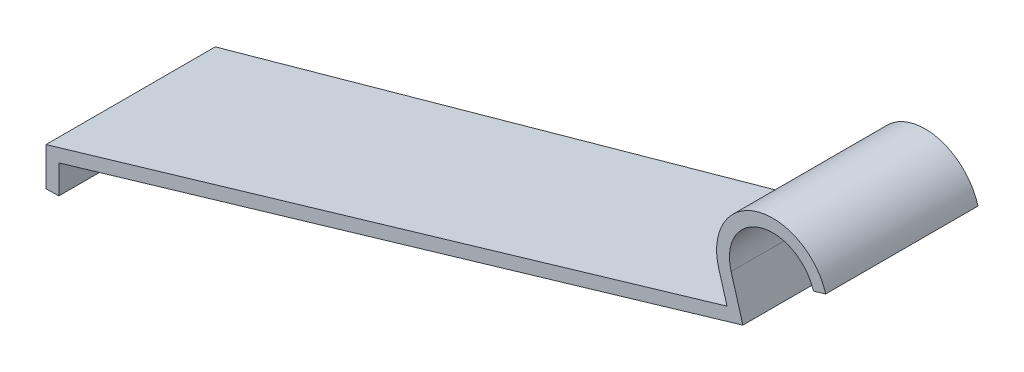
ISO-10303-21;
HEADER;
FILE_DESCRIPTION(('STEP AP214'),'2;1');
FILE_NAME('part.step','',(''),(''),'','','');
FILE_SCHEMA(('AUTOMOTIVE_DESIGN { 1 0 10303 214 1 1 1 1 }'));
ENDSEC;
DATA;
#1=APPLICATION_CONTEXT('core data for automotive mechanical design processes');
#2=APPLICATION_PROTOCOL_DEFINITION('international standard','automotive_design',2000,#1);
#3=PRODUCT_CONTEXT('',#1,'mechanical');
#4=PRODUCT('Part','Part','',(#3));
#5=PRODUCT_RELATED_PRODUCT_CATEGORY('part','',(#4));
#6=PRODUCT_DEFINITION_FORMATION('','',#4);
#7=PRODUCT_DEFINITION_CONTEXT('part definition',#1,'design');
#8=PRODUCT_DEFINITION('design','',#6,#7);
#9=PRODUCT_DEFINITION_SHAPE('','',#8);
#10=(LENGTH_UNIT() NAMED_UNIT(*) SI_UNIT(.MILLI.,.METRE.));
#11=(NAMED_UNIT(*) PLANE_ANGLE_UNIT() SI_UNIT($,.RADIAN.));
#12=(NAMED_UNIT(*) SI_UNIT($,.STERADIAN.) SOLID_ANGLE_UNIT());
#13=UNCERTAINTY_MEASURE_WITH_UNIT(LENGTH_MEASURE(1.E-05),#10,'distance_accuracy_value','');
#14=(GEOMETRIC_REPRESENTATION_CONTEXT(3) GLOBAL_UNCERTAINTY_ASSIGNED_CONTEXT((#13)) GLOBAL_UNIT_ASSIGNED_CONTEXT((#10,
#11,#12)) REPRESENTATION_CONTEXT('',''));
#15=CARTESIAN_POINT('',(0.,0.,0.));
#16=DIRECTION('',(0.,0.,1.));
#17=DIRECTION('',(1.,0.,0.));
#18=AXIS2_PLACEMENT_3D('',#15,#16,#17);
#19=CARTESIAN_POINT('',(-0.3,0.903691041971821,2.));
#20=DIRECTION('',(0.275637355816999,-0.961261695938319,0.));
#21=DIRECTION('',(0.961261695938319,0.275637355816999,0.));
#22=AXIS2_PLACEMENT_3D('',#19,#20,#21);
#23=PLANE('',#22);
#24=DIRECTION('',(0.,0.,-1.));
#25=VECTOR('',#24,1.);
#26=CARTESIAN_POINT('',(-0.3,0.903691041971821,2.));
#27=LINE('',#26,#25);
#28=CARTESIAN_POINT('',(-0.3,0.903691041971821,2.));
#29=VERTEX_POINT('',#28);
#30=CARTESIAN_POINT('',(-0.3,0.903691041971823,-2.));
#31=VERTEX_POINT('',#30);
#32=EDGE_CURVE('E10',#29,#31,#27,.T.);
#33=ORIENTED_EDGE('',*,*,#32,.F.);
#34=DIRECTION('',(0.96120822699316,0.275622023843694,-0.0105472429085632));
#35=VECTOR('',#34,1.);
#36=CARTESIAN_POINT('',(-0.3,0.903691041971821,2.));
#37=LINE('',#36,#35);
#38=CARTESIAN_POINT('',(15.6203859417955,5.46878825028108,1.82530717797592));
#39=VERTEX_POINT('',#38);
#40=EDGE_CURVE('E30',#29,#39,#37,.T.);
#41=ORIENTED_EDGE('',*,*,#40,.T.);
#42=DIRECTION('',(0.,0.,-1.));
#43=VECTOR('',#42,1.);
#44=CARTESIAN_POINT('',(15.6203859417955,5.46878825028108,2.));
#45=LINE('',#44,#43);
#46=CARTESIAN_POINT('',(15.6203859417955,5.46878825028108,-1.82530717797592));
#47=VERTEX_POINT('',#46);
#48=EDGE_CURVE('E98',#39,#47,#45,.T.);
#49=ORIENTED_EDGE('',*,*,#48,.T.);
#50=DIRECTION('',(-0.96120822699316,-0.275622023843694,-0.0105472429085632));
#51=VECTOR('',#50,1.);
#52=CARTESIAN_POINT('',(-0.259447613376775,0.915319251717538,-1.99955502266811));
#53=LINE('',#52,#51);
#54=EDGE_CURVE('E125',#47,#31,#53,.T.);
#55=ORIENTED_EDGE('',*,*,#54,.T.);
#56=EDGE_LOOP('',(#33,#41,#49,#55));
#57=FACE_BOUND('',#56,.T.);
#58=ADVANCED_FACE('F16',(#57),#23,.F.);
#59=CARTESIAN_POINT('',(-0.3,0.903691041971821,2.));
#60=DIRECTION('',(1.,0.,0.));
#61=DIRECTION('',(0.,1.,0.));
#62=AXIS2_PLACEMENT_3D('',#59,#60,#61);
#63=PLANE('',#62);
#64=DIRECTION('',(0.,-1.,0.));
#65=VECTOR('',#64,1.);
#66=CARTESIAN_POINT('',(-0.3,0.903691041971821,-2.));
#67=LINE('',#66,#65);
#68=CARTESIAN_POINT('',(-0.3,0.,-2.));
#69=VERTEX_POINT('',#68);
#70=EDGE_CURVE('E99',#31,#69,#67,.T.);
#71=ORIENTED_EDGE('',*,*,#70,.T.);
#72=DIRECTION('',(0.,0.,-1.));
#73=VECTOR('',#72,1.);
#74=CARTESIAN_POINT('',(-0.3,0.,2.));
#75=LINE('',#74,#73);
#76=CARTESIAN_POINT('',(-0.3,0.,2.));
#77=VERTEX_POINT('',#76);
#78=EDGE_CURVE('E23',#77,#69,#75,.T.);
#79=ORIENTED_EDGE('',*,*,#78,.F.);
#80=DIRECTION('',(0.,-1.,0.));
#81=VECTOR('',#80,1.);
#82=CARTESIAN_POINT('',(-0.3,0.903691041971821,2.));
#83=LINE('',#82,#81);
#84=EDGE_CURVE('E90',#29,#77,#83,.T.);
#85=ORIENTED_EDGE('',*,*,#84,.F.);
#86=ORIENTED_EDGE('',*,*,#32,.T.);
#87=EDGE_LOOP('',(#71,#79,#85,#86));
#88=FACE_BOUND('',#87,.T.);
#89=ADVANCED_FACE('F108',(#88),#63,.F.);
#90=CARTESIAN_POINT('',(-0.3,0.,2.));
#91=DIRECTION('',(0.,1.,0.));
#92=DIRECTION('',(0.,0.,1.));
#93=AXIS2_PLACEMENT_3D('',#90,#91,#92);
#94=PLANE('',#93);
#95=DIRECTION('',(0.,0.,-1.));
#96=VECTOR('',#95,1.);
#97=CARTESIAN_POINT('',(0.,0.,2.));
#98=LINE('',#97,#96);
#99=CARTESIAN_POINT('',(0.,0.,1.99670812963965));
#100=VERTEX_POINT('',#99);
#101=CARTESIAN_POINT('',(0.,0.,-1.99670812963965));
#102=VERTEX_POINT('',#101);
#103=EDGE_CURVE('E105',#100,#102,#98,.T.);
#104=ORIENTED_EDGE('',*,*,#103,.F.);
#105=DIRECTION('',(0.999939803155541,0.,-0.0109722406671593));
#106=VECTOR('',#105,1.);
#107=CARTESIAN_POINT('',(17.9267202021632,0.,1.8));
#108=LINE('',#107,#106);
#109=EDGE_CURVE('E93',#77,#100,#108,.T.);
#110=ORIENTED_EDGE('',*,*,#109,.F.);
#111=ORIENTED_EDGE('',*,*,#78,.T.);
#112=DIRECTION('',(-0.999939803155541,0.,-0.0109722406671592));
#113=VECTOR('',#112,1.);
#114=CARTESIAN_POINT('',(17.9267202021632,0.,-1.8));
#115=LINE('',#114,#113);
#116=EDGE_CURVE('E38',#102,#69,#115,.T.);
#117=ORIENTED_EDGE('',*,*,#116,.F.);
#118=EDGE_LOOP('',(#104,#110,#111,#117));
#119=FACE_BOUND('',#118,.T.);
#120=ADVANCED_FACE('F104',(#119),#94,.F.);
#121=CARTESIAN_POINT('',(0.,0.677624826940983,2.));
#122=DIRECTION('',(-1.,0.,0.));
#123=DIRECTION('',(0.,-1.,0.));
#124=AXIS2_PLACEMENT_3D('',#121,#122,#123);
#125=PLANE('',#124);
#126=DIRECTION('',(0.,0.,-1.));
#127=VECTOR('',#126,1.);
#128=CARTESIAN_POINT('',(0.,0.677624826940983,2.));
#129=LINE('',#128,#127);
#130=CARTESIAN_POINT('',(0.,0.677624826940983,1.99670812963965));
#131=VERTEX_POINT('',#130);
#132=CARTESIAN_POINT('',(0.,0.677624826940983,-1.99670812963965));
#133=VERTEX_POINT('',#132);
#134=EDGE_CURVE('E109',#131,#133,#129,.T.);
#135=ORIENTED_EDGE('',*,*,#134,.F.);
#136=DIRECTION('',(0.,-1.,0.));
#137=VECTOR('',#136,1.);
#138=CARTESIAN_POINT('',(0.,0.677624826940983,1.99670812963965));
#139=LINE('',#138,#137);
#140=EDGE_CURVE('E150',#131,#100,#139,.T.);
#141=ORIENTED_EDGE('',*,*,#140,.T.);
#142=ORIENTED_EDGE('',*,*,#103,.T.);
#143=DIRECTION('',(0.,1.,0.));
#144=VECTOR('',#143,1.);
#145=CARTESIAN_POINT('',(0.,0.677624826940983,-1.99670812963965));
#146=LINE('',#145,#144);
#147=EDGE_CURVE('E128',#102,#133,#146,.T.);
#148=ORIENTED_EDGE('',*,*,#147,.T.);
#149=EDGE_LOOP('',(#135,#141,#142,#148));
#150=FACE_BOUND('',#149,.T.);
#151=ADVANCED_FACE('F190',(#150),#125,.F.);
#152=CARTESIAN_POINT('',(0.,0.677624826940983,2.));
#153=DIRECTION('',(-0.275637355816999,0.961261695938319,0.));
#154=DIRECTION('',(-0.961261695938319,-0.275637355816999,0.));
#155=AXIS2_PLACEMENT_3D('',#152,#153,#154);
#156=PLANE('',#155);
#157=DIRECTION('',(0.,0.,-1.));
#158=VECTOR('',#157,1.);
#159=CARTESIAN_POINT('',(15.9914556573221,5.26310094824469,2.));
#160=LINE('',#159,#158);
#161=CARTESIAN_POINT('',(15.9914556573221,5.26310094824469,1.8212354666487));
#162=VERTEX_POINT('',#161);
#163=CARTESIAN_POINT('',(15.9914556573221,5.26310094824469,-1.8212354666487));
#164=VERTEX_POINT('',#163);
#165=EDGE_CURVE('E113',#162,#164,#160,.T.);
#166=ORIENTED_EDGE('',*,*,#165,.F.);
#167=DIRECTION('',(-0.96120822699316,-0.275622023843694,0.0105472429085632));
#168=VECTOR('',#167,1.);
#169=CARTESIAN_POINT('',(-3.33732998912307E-05,0.677615257301232,1.99670849584157));
#170=LINE('',#169,#168);
#171=EDGE_CURVE('E152',#162,#131,#170,.T.);
#172=ORIENTED_EDGE('',*,*,#171,.T.);
#173=ORIENTED_EDGE('',*,*,#134,.T.);
#174=DIRECTION('',(0.96120822699316,0.275622023843694,0.0105472429085632));
#175=VECTOR('',#174,1.);
#176=CARTESIAN_POINT('',(0.0405190133233337,0.689243467046949,-1.99626351850968));
#177=LINE('',#176,#175);
#178=EDGE_CURVE('E131',#133,#164,#177,.T.);
#179=ORIENTED_EDGE('',*,*,#178,.T.);
#180=EDGE_LOOP('',(#166,#172,#173,#179));
#181=FACE_BOUND('',#180,.T.);
#182=ADVANCED_FACE('F195',(#181),#156,.F.);
#183=CARTESIAN_POINT('',(15.7158183015051,6.224362644183,2.));
#184=DIRECTION('',(-0.96126169593832,-0.275637355816996,0.));
#185=DIRECTION('',(0.275637355816996,-0.96126169593832,0.));
#186=AXIS2_PLACEMENT_3D('',#183,#184,#185);
#187=PLANE('',#186);
#188=DIRECTION('',(0.,0.,-1.));
#189=VECTOR('',#188,1.);
#190=CARTESIAN_POINT('',(15.7158183015051,6.224362644183,2.));
#191=LINE('',#190,#189);
#192=CARTESIAN_POINT('',(15.7158183015051,6.224362644183,1.82426000812144));
#193=VERTEX_POINT('',#192);
#194=CARTESIAN_POINT('',(15.7158183015051,6.224362644183,-1.82426000812144));
#195=VERTEX_POINT('',#194);
#196=EDGE_CURVE('E115',#193,#195,#191,.T.);
#197=ORIENTED_EDGE('',*,*,#196,.F.);
#198=DIRECTION('',(0.275636095080899,-0.961257299229044,-0.00302452763880346));
#199=VECTOR('',#198,1.);
#200=CARTESIAN_POINT('',(15.7156717925239,6.22487358172002,1.82426161575001));
#201=LINE('',#200,#199);
#202=EDGE_CURVE('E155',#193,#162,#201,.T.);
#203=ORIENTED_EDGE('',*,*,#202,.T.);
#204=ORIENTED_EDGE('',*,*,#165,.T.);
#205=DIRECTION('',(-0.275636095080899,0.961257299229044,-0.00302452763880345));
#206=VECTOR('',#205,1.);
#207=CARTESIAN_POINT('',(15.7190064684752,6.21324418464194,-1.82422502468026));
#208=LINE('',#207,#206);
#209=EDGE_CURVE('E134',#164,#195,#208,.T.);
#210=ORIENTED_EDGE('',*,*,#209,.T.);
#211=EDGE_LOOP('',(#197,#203,#204,#210));
#212=FACE_BOUND('',#211,.T.);
#213=ADVANCED_FACE('F199',(#212),#187,.F.);
#214=CARTESIAN_POINT('',(16.6770799974434,6.5,2.));
#215=DIRECTION('',(0.,0.,-1.));
#216=DIRECTION('',(-1.,0.,0.));
#217=AXIS2_PLACEMENT_3D('',#214,#215,#216);
#218=CYLINDRICAL_SURFACE('',#217,1.);
#219=DIRECTION('',(0.,0.,-1.));
#220=VECTOR('',#219,1.);
#221=CARTESIAN_POINT('',(17.6383416933818,6.77563735581691,2.));
#222=LINE('',#221,#220);
#223=CARTESIAN_POINT('',(17.6383416933818,6.77563735581691,1.8031643488854));
#224=VERTEX_POINT('',#223);
#225=CARTESIAN_POINT('',(17.6383416933818,6.77563735581691,-1.8031643488854));
#226=VERTEX_POINT('',#225);
#227=EDGE_CURVE('E117',#224,#226,#222,.T.);
#228=ORIENTED_EDGE('',*,*,#227,.F.);
#229=CARTESIAN_POINT('',(16.6770799974434,6.5,1.81371217850342));
#230=DIRECTION('',(-0.0109722406671593,0.,-0.999939803155541));
#231=DIRECTION('',(0.999939803155541,0.,-0.0109722406671593));
#232=AXIS2_PLACEMENT_3D('',#229,#230,#231);
#233=ELLIPSE('',#232,1.00006020046834,1.);
#234=EDGE_CURVE('E158',#224,#193,#233,.F.);
#235=ORIENTED_EDGE('',*,*,#234,.T.);
#236=ORIENTED_EDGE('',*,*,#196,.T.);
#237=CARTESIAN_POINT('',(16.6770799974434,6.5,-1.81371217850342));
#238=DIRECTION('',(-0.0109722406671592,0.,0.999939803155541));
#239=DIRECTION('',(-0.999939803155541,0.,-0.0109722406671592));
#240=AXIS2_PLACEMENT_3D('',#237,#238,#239);
#241=ELLIPSE('',#240,1.00006020046834,1.);
#242=EDGE_CURVE('E137',#195,#226,#241,.F.);
#243=ORIENTED_EDGE('',*,*,#242,.T.);
#244=EDGE_LOOP('',(#228,#235,#236,#243));
#245=FACE_BOUND('',#244,.T.);
#246=ADVANCED_FACE('F203',(#245),#218,.F.);
#247=CARTESIAN_POINT('',(17.6383416933818,6.77563735581691,2.));
#248=DIRECTION('',(-0.275637355817328,0.961261695938225,0.));
#249=DIRECTION('',(-0.961261695938225,-0.275637355817328,0.));
#250=AXIS2_PLACEMENT_3D('',#247,#248,#249);
#251=PLANE('',#250);
#252=DIRECTION('',(0.,0.,-1.));
#253=VECTOR('',#252,1.);
#254=CARTESIAN_POINT('',(17.9267202021632,6.85832856256211,2.));
#255=LINE('',#254,#253);
#256=CARTESIAN_POINT('',(17.9267202021632,6.8583285625621,1.8));
#257=VERTEX_POINT('',#256);
#258=CARTESIAN_POINT('',(17.9267202021632,6.8583285625621,-1.8));
#259=VERTEX_POINT('',#258);
#260=EDGE_CURVE('E119',#257,#259,#255,.T.);
#261=ORIENTED_EDGE('',*,*,#260,.F.);
#262=DIRECTION('',(-0.961208226993066,-0.275622023844023,0.0105472429085622));
#263=VECTOR('',#262,1.);
#264=CARTESIAN_POINT('',(17.6363461545254,6.77506514425776,1.80318624573611));
#265=LINE('',#264,#263);
#266=EDGE_CURVE('E161',#257,#224,#265,.T.);
#267=ORIENTED_EDGE('',*,*,#266,.T.);
#268=ORIENTED_EDGE('',*,*,#227,.T.);
#269=DIRECTION('',(0.961208226993066,0.275622023844023,0.0105472429085622));
#270=VECTOR('',#269,1.);
#271=CARTESIAN_POINT('',(17.6768985411486,6.78669335400349,-1.80274126840423));
#272=LINE('',#271,#270);
#273=EDGE_CURVE('E140',#226,#259,#272,.T.);
#274=ORIENTED_EDGE('',*,*,#273,.T.);
#275=EDGE_LOOP('',(#261,#267,#268,#274));
#276=FACE_BOUND('',#275,.T.);
#277=ADVANCED_FACE('F207',(#276),#251,.F.);
#278=CARTESIAN_POINT('',(16.6770799974434,6.5,2.));
#279=DIRECTION('',(0.,0.,-1.));
#280=DIRECTION('',(-1.,0.,0.));
#281=AXIS2_PLACEMENT_3D('',#278,#279,#280);
#282=CYLINDRICAL_SURFACE('',#281,1.3);
#283=DIRECTION('',(0.,0.,-1.));
#284=VECTOR('',#283,1.);
#285=CARTESIAN_POINT('',(15.4274397927236,6.14167143743791,2.));
#286=LINE('',#285,#284);
#287=CARTESIAN_POINT('',(15.4274397927236,6.14167143743791,1.82742435700684));
#288=VERTEX_POINT('',#287);
#289=CARTESIAN_POINT('',(15.4274397927236,6.14167143743791,-1.82742435700684));
#290=VERTEX_POINT('',#289);
#291=EDGE_CURVE('E121',#288,#290,#286,.T.);
#292=ORIENTED_EDGE('',*,*,#291,.F.);
#293=CARTESIAN_POINT('',(16.6770799974434,6.5,1.81371217850342));
#294=DIRECTION('',(-0.0109722406671593,0.,-0.999939803155541));
#295=DIRECTION('',(0.999939803155541,0.,-0.0109722406671593));
#296=AXIS2_PLACEMENT_3D('',#293,#294,#295);
#297=ELLIPSE('',#296,1.30007826060884,1.3);
#298=EDGE_CURVE('E165',#288,#257,#297,.T.);
#299=ORIENTED_EDGE('',*,*,#298,.T.);
#300=ORIENTED_EDGE('',*,*,#260,.T.);
#301=CARTESIAN_POINT('',(16.6770799974434,6.5,-1.81371217850342));
#302=DIRECTION('',(-0.0109722406671592,0.,0.999939803155541));
#303=DIRECTION('',(-0.999939803155541,0.,-0.0109722406671592));
#304=AXIS2_PLACEMENT_3D('',#301,#302,#303);
#305=ELLIPSE('',#304,1.30007826060884,1.3);
#306=EDGE_CURVE('E143',#259,#290,#305,.T.);
#307=ORIENTED_EDGE('',*,*,#306,.T.);
#308=EDGE_LOOP('',(#292,#299,#300,#307));
#309=FACE_BOUND('',#308,.T.);
#310=ADVANCED_FACE('F173',(#309),#282,.T.);
#311=CARTESIAN_POINT('',(15.4274397927236,6.14167143743791,2.));
#312=DIRECTION('',(0.961261695938319,0.275637355817,0.));
#313=DIRECTION('',(-0.275637355817,0.961261695938319,0.));
#314=AXIS2_PLACEMENT_3D('',#311,#312,#313);
#315=PLANE('',#314);
#316=ORIENTED_EDGE('',*,*,#48,.F.);
#317=DIRECTION('',(-0.275636095080903,0.961257299229043,0.00302452763880349));
#318=VECTOR('',#317,1.);
#319=CARTESIAN_POINT('',(15.427295921762,6.1421731751075,1.82742593568869));
#320=LINE('',#319,#318);
#321=EDGE_CURVE('E106',#39,#288,#320,.T.);
#322=ORIENTED_EDGE('',*,*,#321,.T.);
#323=ORIENTED_EDGE('',*,*,#291,.T.);
#324=DIRECTION('',(0.275636095080903,-0.961257299229043,0.00302452763880349));
#325=VECTOR('',#324,1.);
#326=CARTESIAN_POINT('',(15.4306305977133,6.13054377802942,-1.82738934461893));
#327=LINE('',#326,#325);
#328=EDGE_CURVE('E146',#290,#47,#327,.T.);
#329=ORIENTED_EDGE('',*,*,#328,.T.);
#330=EDGE_LOOP('',(#316,#322,#323,#329));
#331=FACE_BOUND('',#330,.T.);
#332=ADVANCED_FACE('F171',(#331),#315,.F.);
#333=CARTESIAN_POINT('',(17.9267202021632,7.8,-1.8));
#334=DIRECTION('',(-0.0109722406671592,0.,0.999939803155541));
#335=DIRECTION('',(0.999939803155541,0.,0.0109722406671592));
#336=AXIS2_PLACEMENT_3D('',#333,#334,#335);
#337=PLANE('',#336);
#338=ORIENTED_EDGE('',*,*,#328,.F.);
#339=ORIENTED_EDGE('',*,*,#306,.F.);
#340=ORIENTED_EDGE('',*,*,#273,.F.);
#341=ORIENTED_EDGE('',*,*,#242,.F.);
#342=ORIENTED_EDGE('',*,*,#209,.F.);
#343=ORIENTED_EDGE('',*,*,#178,.F.);
#344=ORIENTED_EDGE('',*,*,#147,.F.);
#345=ORIENTED_EDGE('',*,*,#116,.T.);
#346=ORIENTED_EDGE('',*,*,#70,.F.);
#347=ORIENTED_EDGE('',*,*,#54,.F.);
#348=EDGE_LOOP('',(#338,#339,#340,#341,#342,#343,#344,#345,#346,#347));
#349=FACE_BOUND('',#348,.T.);
#350=ADVANCED_FACE('F180',(#349),#337,.F.);
#351=CARTESIAN_POINT('',(17.9267202021632,7.8,1.8));
#352=DIRECTION('',(-0.0109722406671593,0.,-0.999939803155541));
#353=DIRECTION('',(-0.999939803155541,0.,0.0109722406671593));
#354=AXIS2_PLACEMENT_3D('',#351,#352,#353);
#355=PLANE('',#354);
#356=ORIENTED_EDGE('',*,*,#171,.F.);
#357=ORIENTED_EDGE('',*,*,#202,.F.);
#358=ORIENTED_EDGE('',*,*,#234,.F.);
#359=ORIENTED_EDGE('',*,*,#266,.F.);
#360=ORIENTED_EDGE('',*,*,#298,.F.);
#361=ORIENTED_EDGE('',*,*,#321,.F.);
#362=ORIENTED_EDGE('',*,*,#40,.F.);
#363=ORIENTED_EDGE('',*,*,#84,.T.);
#364=ORIENTED_EDGE('',*,*,#109,.T.);
#365=ORIENTED_EDGE('',*,*,#140,.F.);
#366=EDGE_LOOP('',(#356,#357,#358,#359,#360,#361,#362,#363,#364,#365));
#367=FACE_BOUND('',#366,.T.);
#368=ADVANCED_FACE('F92',(#367),#355,.F.);
#369=CLOSED_SHELL('',(#58,#89,#120,#151,#182,#213,#246,#277,#310,#332,#350,#368));
#370=MANIFOLD_SOLID_BREP('B1',#369);
#371=ADVANCED_BREP_SHAPE_REPRESENTATION('',(#18,#370),#14);
#372=SHAPE_DEFINITION_REPRESENTATION(#9,#371);
ENDSEC;
END-ISO-10303-21;
